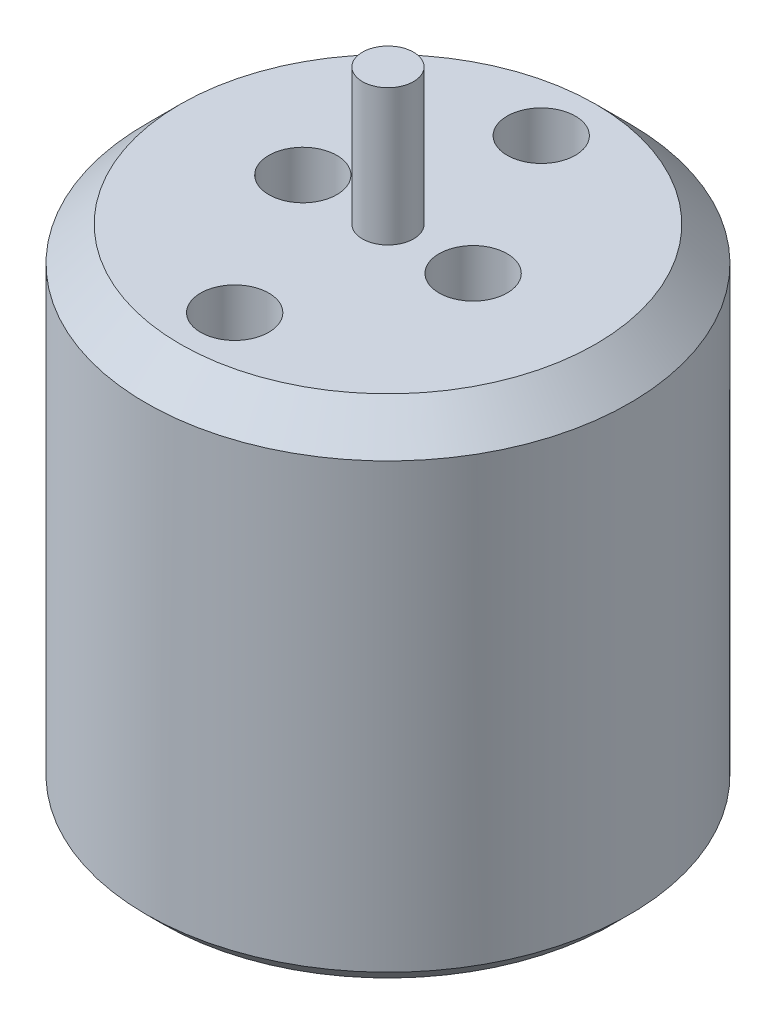
ISO-10303-21;
HEADER;
FILE_DESCRIPTION(('STEP AP214'),'2;1');
FILE_NAME('part.step','',(''),(''),'','','');
FILE_SCHEMA(('AUTOMOTIVE_DESIGN { 1 0 10303 214 1 1 1 1 }'));
ENDSEC;
DATA;
#1=APPLICATION_CONTEXT('core data for automotive mechanical design processes');
#2=APPLICATION_PROTOCOL_DEFINITION('international standard','automotive_design',2000,#1);
#3=PRODUCT_CONTEXT('',#1,'mechanical');
#4=PRODUCT('Part','Part','',(#3));
#5=PRODUCT_RELATED_PRODUCT_CATEGORY('part','',(#4));
#6=PRODUCT_DEFINITION_FORMATION('','',#4);
#7=PRODUCT_DEFINITION_CONTEXT('part definition',#1,'design');
#8=PRODUCT_DEFINITION('design','',#6,#7);
#9=PRODUCT_DEFINITION_SHAPE('','',#8);
#10=(LENGTH_UNIT() NAMED_UNIT(*) SI_UNIT(.MILLI.,.METRE.));
#11=(NAMED_UNIT(*) PLANE_ANGLE_UNIT() SI_UNIT($,.RADIAN.));
#12=(NAMED_UNIT(*) SI_UNIT($,.STERADIAN.) SOLID_ANGLE_UNIT());
#13=UNCERTAINTY_MEASURE_WITH_UNIT(LENGTH_MEASURE(1.E-05),#10,'distance_accuracy_value','');
#14=(GEOMETRIC_REPRESENTATION_CONTEXT(3) GLOBAL_UNCERTAINTY_ASSIGNED_CONTEXT((#13)) GLOBAL_UNIT_ASSIGNED_CONTEXT((#10,
#11,#12)) REPRESENTATION_CONTEXT('',''));
#15=CARTESIAN_POINT('',(0.,0.,0.));
#16=DIRECTION('',(0.,0.,1.));
#17=DIRECTION('',(1.,0.,0.));
#18=AXIS2_PLACEMENT_3D('',#15,#16,#17);
#19=CARTESIAN_POINT('',(0.,14.5,0.));
#20=DIRECTION('',(0.,-1.,0.));
#21=DIRECTION('',(0.,0.,-1.));
#22=AXIS2_PLACEMENT_3D('',#19,#20,#21);
#23=CYLINDRICAL_SURFACE('',#22,7.1);
#24=CARTESIAN_POINT('',(0.,0.500000000000014,0.));
#25=DIRECTION('',(0.,1.,0.));
#26=DIRECTION('',(0.,0.,1.));
#27=AXIS2_PLACEMENT_3D('',#24,#25,#26);
#28=CIRCLE('',#27,7.1);
#29=CARTESIAN_POINT('',(0.,0.500000000000014,-7.1));
#30=VERTEX_POINT('',#29);
#31=EDGE_CURVE('E42',#30,#30,#28,.T.);
#32=CARTESIAN_POINT('',(0.,13.5,0.));
#33=DIRECTION('',(0.,1.,0.));
#34=DIRECTION('',(0.,0.,1.));
#35=AXIS2_PLACEMENT_3D('',#32,#33,#34);
#36=CIRCLE('',#35,7.1);
#37=CARTESIAN_POINT('',(0.,13.5,-7.1));
#38=VERTEX_POINT('',#37);
#39=EDGE_CURVE('E46',#38,#38,#36,.F.);
#40=CARTESIAN_POINT('',(0.,0.500000000000014,-7.1));
#41=CARTESIAN_POINT('',(0.,0.635416666666681,-7.1));
#42=CARTESIAN_POINT('',(0.,0.770833333333348,-7.1));
#43=CARTESIAN_POINT('',(0.,1.04166666666668,-7.1));
#44=CARTESIAN_POINT('',(0.,1.17708333333335,-7.1));
#45=CARTESIAN_POINT('',(0.,1.44791666666668,-7.1));
#46=CARTESIAN_POINT('',(0.,1.58333333333335,-7.1));
#47=CARTESIAN_POINT('',(0.,1.85416666666668,-7.1));
#48=CARTESIAN_POINT('',(0.,1.98958333333335,-7.1));
#49=CARTESIAN_POINT('',(0.,2.26041666666668,-7.1));
#50=CARTESIAN_POINT('',(0.,2.39583333333335,-7.1));
#51=CARTESIAN_POINT('',(0.,2.66666666666668,-7.1));
#52=CARTESIAN_POINT('',(0.,2.80208333333335,-7.1));
#53=CARTESIAN_POINT('',(0.,3.07291666666668,-7.1));
#54=CARTESIAN_POINT('',(0.,3.20833333333335,-7.1));
#55=CARTESIAN_POINT('',(0.,3.47916666666668,-7.1));
#56=CARTESIAN_POINT('',(0.,3.61458333333335,-7.1));
#57=CARTESIAN_POINT('',(0.,3.88541666666668,-7.1));
#58=CARTESIAN_POINT('',(0.,4.02083333333335,-7.1));
#59=CARTESIAN_POINT('',(0.,4.29166666666668,-7.1));
#60=CARTESIAN_POINT('',(0.,4.42708333333335,-7.1));
#61=CARTESIAN_POINT('',(0.,4.69791666666668,-7.1));
#62=CARTESIAN_POINT('',(0.,4.83333333333335,-7.1));
#63=CARTESIAN_POINT('',(0.,5.10416666666668,-7.1));
#64=CARTESIAN_POINT('',(0.,5.23958333333335,-7.1));
#65=CARTESIAN_POINT('',(0.,5.51041666666668,-7.1));
#66=CARTESIAN_POINT('',(0.,5.64583333333335,-7.1));
#67=CARTESIAN_POINT('',(0.,5.91666666666668,-7.1));
#68=CARTESIAN_POINT('',(0.,6.05208333333335,-7.1));
#69=CARTESIAN_POINT('',(0.,6.32291666666668,-7.1));
#70=CARTESIAN_POINT('',(0.,6.45833333333335,-7.1));
#71=CARTESIAN_POINT('',(0.,6.72916666666668,-7.1));
#72=CARTESIAN_POINT('',(0.,6.86458333333335,-7.1));
#73=CARTESIAN_POINT('',(0.,7.13541666666668,-7.1));
#74=CARTESIAN_POINT('',(0.,7.27083333333335,-7.1));
#75=CARTESIAN_POINT('',(0.,7.54166666666668,-7.1));
#76=CARTESIAN_POINT('',(0.,7.67708333333335,-7.1));
#77=CARTESIAN_POINT('',(0.,7.94791666666668,-7.1));
#78=CARTESIAN_POINT('',(0.,8.08333333333335,-7.1));
#79=CARTESIAN_POINT('',(0.,8.35416666666668,-7.1));
#80=CARTESIAN_POINT('',(0.,8.48958333333335,-7.1));
#81=CARTESIAN_POINT('',(0.,8.76041666666668,-7.1));
#82=CARTESIAN_POINT('',(0.,8.89583333333335,-7.1));
#83=CARTESIAN_POINT('',(0.,9.16666666666668,-7.1));
#84=CARTESIAN_POINT('',(0.,9.30208333333335,-7.1));
#85=CARTESIAN_POINT('',(0.,9.57291666666668,-7.1));
#86=CARTESIAN_POINT('',(0.,9.70833333333335,-7.1));
#87=CARTESIAN_POINT('',(0.,9.97916666666668,-7.1));
#88=CARTESIAN_POINT('',(0.,10.1145833333333,-7.1));
#89=CARTESIAN_POINT('',(0.,10.3854166666667,-7.1));
#90=CARTESIAN_POINT('',(0.,10.5208333333333,-7.1));
#91=CARTESIAN_POINT('',(0.,10.7916666666667,-7.1));
#92=CARTESIAN_POINT('',(0.,10.9270833333333,-7.1));
#93=CARTESIAN_POINT('',(0.,11.1979166666667,-7.1));
#94=CARTESIAN_POINT('',(0.,11.3333333333333,-7.1));
#95=CARTESIAN_POINT('',(0.,11.6041666666667,-7.1));
#96=CARTESIAN_POINT('',(0.,11.7395833333333,-7.1));
#97=CARTESIAN_POINT('',(0.,12.0104166666667,-7.1));
#98=CARTESIAN_POINT('',(0.,12.1458333333333,-7.1));
#99=CARTESIAN_POINT('',(0.,12.4166666666667,-7.1));
#100=CARTESIAN_POINT('',(0.,12.5520833333333,-7.1));
#101=CARTESIAN_POINT('',(0.,12.8229166666667,-7.1));
#102=CARTESIAN_POINT('',(0.,12.9583333333333,-7.1));
#103=CARTESIAN_POINT('',(0.,13.2291666666667,-7.1));
#104=CARTESIAN_POINT('',(0.,13.3645833333333,-7.1));
#105=CARTESIAN_POINT('',(0.,13.5,-7.1));
#106=B_SPLINE_CURVE_WITH_KNOTS('',3,(#40,#41,#42,#43,#44,#45,#46,#47,#48,#49,#50,#51,#52,#53,
#54,#55,#56,#57,#58,#59,#60,#61,#62,#63,#64,#65,#66,#67,#68,#69,#70,#71,#72,#73,#74,#75,#76,#77,
#78,#79,#80,#81,#82,#83,#84,#85,#86,#87,#88,#89,#90,#91,#92,#93,#94,#95,#96,#97,#98,#99,#100,
#101,#102,#103,#104,#105),.UNSPECIFIED.,.F.,.F.,(4,2,2,2,2,2,2,2,2,2,2,2,2,2,2,2,2,2,2,2,2,2,2,
2,2,2,2,2,2,2,2,2,4),(0.,0.40625,0.812500000000001,1.21875,1.625,2.03125,2.4375,2.84375,3.25,
3.65625,4.0625,4.46875,4.875,5.28125,5.6875,6.09375,6.5,6.90625,7.3125,7.71875,8.125,8.53125,
8.9375,9.34375,9.75,10.15625,10.5625,10.96875,11.375,11.78125,12.1875,12.59375,13.),.UNSPECIFIED.);
#107=EDGE_CURVE('BSEAM35',#30,#38,#106,.T.);
#108=ORIENTED_EDGE('',*,*,#31,.T.);
#109=ORIENTED_EDGE('',*,*,#39,.T.);
#110=ORIENTED_EDGE('',*,*,#107,.T.);
#111=ORIENTED_EDGE('',*,*,#107,.F.);
#112=EDGE_LOOP('',(#108,#110,#109,#111));
#113=FACE_BOUND('',#112,.T.);
#114=ADVANCED_FACE('F35',(#113),#23,.T.);
#115=CARTESIAN_POINT('',(0.,14.5,0.));
#116=DIRECTION('',(0.,1.,0.));
#117=DIRECTION('',(0.,0.,1.));
#118=AXIS2_PLACEMENT_3D('',#115,#116,#117);
#119=PLANE('',#118);
#120=CARTESIAN_POINT('',(0.,14.5,0.));
#121=DIRECTION('',(0.,1.,0.));
#122=DIRECTION('',(0.,0.,1.));
#123=AXIS2_PLACEMENT_3D('',#120,#121,#122);
#124=CIRCLE('',#123,6.10000000000002);
#125=CARTESIAN_POINT('',(0.,14.5,6.10000000000002));
#126=VERTEX_POINT('',#125);
#127=EDGE_CURVE('E50',#126,#126,#124,.T.);
#128=ORIENTED_EDGE('',*,*,#127,.T.);
#129=EDGE_LOOP('',(#128));
#130=FACE_BOUND('',#129,.T.);
#131=CARTESIAN_POINT('',(0.,14.5,-4.5));
#132=DIRECTION('',(0.,1.,0.));
#133=DIRECTION('',(0.,0.,1.));
#134=AXIS2_PLACEMENT_3D('',#131,#132,#133);
#135=CIRCLE('',#134,1.);
#136=CARTESIAN_POINT('',(0.,14.5,-3.5));
#137=VERTEX_POINT('',#136);
#138=EDGE_CURVE('E104',#137,#137,#135,.T.);
#139=ORIENTED_EDGE('',*,*,#138,.F.);
#140=EDGE_LOOP('',(#139));
#141=FACE_BOUND('',#140,.T.);
#142=CARTESIAN_POINT('',(0.,14.5,4.5));
#143=DIRECTION('',(0.,1.,0.));
#144=DIRECTION('',(0.,0.,1.));
#145=AXIS2_PLACEMENT_3D('',#142,#143,#144);
#146=CIRCLE('',#145,1.);
#147=CARTESIAN_POINT('',(0.,14.5,5.5));
#148=VERTEX_POINT('',#147);
#149=EDGE_CURVE('E98',#148,#148,#146,.T.);
#150=ORIENTED_EDGE('',*,*,#149,.F.);
#151=EDGE_LOOP('',(#150));
#152=FACE_BOUND('',#151,.T.);
#153=CARTESIAN_POINT('',(2.5,14.5,0.));
#154=DIRECTION('',(0.,1.,0.));
#155=DIRECTION('',(0.,0.,1.));
#156=AXIS2_PLACEMENT_3D('',#153,#154,#155);
#157=CIRCLE('',#156,1.);
#158=CARTESIAN_POINT('',(2.5,14.5,1.));
#159=VERTEX_POINT('',#158);
#160=EDGE_CURVE('E92',#159,#159,#157,.T.);
#161=ORIENTED_EDGE('',*,*,#160,.F.);
#162=EDGE_LOOP('',(#161));
#163=FACE_BOUND('',#162,.T.);
#164=CARTESIAN_POINT('',(-2.5,14.5,0.));
#165=DIRECTION('',(0.,1.,0.));
#166=DIRECTION('',(0.,0.,1.));
#167=AXIS2_PLACEMENT_3D('',#164,#165,#166);
#168=CIRCLE('',#167,1.);
#169=CARTESIAN_POINT('',(-2.5,14.5,1.));
#170=VERTEX_POINT('',#169);
#171=EDGE_CURVE('E86',#170,#170,#168,.T.);
#172=ORIENTED_EDGE('',*,*,#171,.F.);
#173=EDGE_LOOP('',(#172));
#174=FACE_BOUND('',#173,.T.);
#175=CARTESIAN_POINT('',(0.,14.5,0.));
#176=DIRECTION('',(0.,1.,0.));
#177=DIRECTION('',(0.,0.,1.));
#178=AXIS2_PLACEMENT_3D('',#175,#176,#177);
#179=CIRCLE('',#178,0.75);
#180=CARTESIAN_POINT('',(0.,14.5,0.75));
#181=VERTEX_POINT('',#180);
#182=EDGE_CURVE('E56',#181,#181,#179,.T.);
#183=ORIENTED_EDGE('',*,*,#182,.F.);
#184=EDGE_LOOP('',(#183));
#185=FACE_BOUND('',#184,.T.);
#186=ADVANCED_FACE('F119',(#130,#141,#152,#163,#174,#185),#119,.T.);
#187=CARTESIAN_POINT('',(0.,0.,0.));
#188=DIRECTION('',(0.,1.,0.));
#189=DIRECTION('',(0.,0.,1.));
#190=AXIS2_PLACEMENT_3D('',#187,#188,#189);
#191=PLANE('',#190);
#192=CARTESIAN_POINT('',(0.,0.,0.));
#193=DIRECTION('',(0.,1.,0.));
#194=DIRECTION('',(0.,0.,1.));
#195=AXIS2_PLACEMENT_3D('',#192,#193,#194);
#196=CIRCLE('',#195,6.59999999999998);
#197=CARTESIAN_POINT('',(0.,0.,6.59999999999998));
#198=VERTEX_POINT('',#197);
#199=EDGE_CURVE('E10',#198,#198,#196,.F.);
#200=ORIENTED_EDGE('',*,*,#199,.T.);
#201=EDGE_LOOP('',(#200));
#202=FACE_BOUND('',#201,.T.);
#203=CARTESIAN_POINT('',(0.,0.,4.5));
#204=DIRECTION('',(0.,-1.,0.));
#205=DIRECTION('',(0.,0.,-1.));
#206=AXIS2_PLACEMENT_3D('',#203,#204,#205);
#207=CIRCLE('',#206,1.);
#208=CARTESIAN_POINT('',(0.,0.,3.5));
#209=VERTEX_POINT('',#208);
#210=EDGE_CURVE('E81',#209,#209,#207,.T.);
#211=ORIENTED_EDGE('',*,*,#210,.F.);
#212=EDGE_LOOP('',(#211));
#213=FACE_BOUND('',#212,.T.);
#214=CARTESIAN_POINT('',(0.,0.,-4.5));
#215=DIRECTION('',(0.,-1.,0.));
#216=DIRECTION('',(0.,0.,-1.));
#217=AXIS2_PLACEMENT_3D('',#214,#215,#216);
#218=CIRCLE('',#217,1.);
#219=CARTESIAN_POINT('',(0.,0.,-5.5));
#220=VERTEX_POINT('',#219);
#221=EDGE_CURVE('E75',#220,#220,#218,.T.);
#222=ORIENTED_EDGE('',*,*,#221,.F.);
#223=EDGE_LOOP('',(#222));
#224=FACE_BOUND('',#223,.T.);
#225=CARTESIAN_POINT('',(4.5,0.,0.));
#226=DIRECTION('',(0.,-1.,0.));
#227=DIRECTION('',(0.,0.,-1.));
#228=AXIS2_PLACEMENT_3D('',#225,#226,#227);
#229=CIRCLE('',#228,1.);
#230=CARTESIAN_POINT('',(4.5,0.,-0.999999999999998));
#231=VERTEX_POINT('',#230);
#232=EDGE_CURVE('E68',#231,#231,#229,.T.);
#233=ORIENTED_EDGE('',*,*,#232,.F.);
#234=EDGE_LOOP('',(#233));
#235=FACE_BOUND('',#234,.T.);
#236=CARTESIAN_POINT('',(-4.5,0.,0.));
#237=DIRECTION('',(0.,-1.,0.));
#238=DIRECTION('',(0.,0.,-1.));
#239=AXIS2_PLACEMENT_3D('',#236,#237,#238);
#240=CIRCLE('',#239,1.);
#241=CARTESIAN_POINT('',(-4.5,0.,-1.));
#242=VERTEX_POINT('',#241);
#243=EDGE_CURVE('E62',#242,#242,#240,.T.);
#244=ORIENTED_EDGE('',*,*,#243,.F.);
#245=EDGE_LOOP('',(#244));
#246=FACE_BOUND('',#245,.T.);
#247=ADVANCED_FACE('F122',(#202,#213,#224,#235,#246),#191,.F.);
#248=CARTESIAN_POINT('',(0.,18.5,0.));
#249=DIRECTION('',(0.,-1.,0.));
#250=DIRECTION('',(0.,0.,-1.));
#251=AXIS2_PLACEMENT_3D('',#248,#249,#250);
#252=CYLINDRICAL_SURFACE('',#251,0.75);
#253=CARTESIAN_POINT('',(0.,18.5,0.));
#254=DIRECTION('',(0.,1.,0.));
#255=DIRECTION('',(0.,0.,1.));
#256=AXIS2_PLACEMENT_3D('',#253,#254,#255);
#257=CIRCLE('',#256,0.75);
#258=CARTESIAN_POINT('',(0.,18.5,0.75));
#259=VERTEX_POINT('',#258);
#260=EDGE_CURVE('E55',#259,#259,#257,.T.);
#261=ORIENTED_EDGE('',*,*,#260,.F.);
#262=EDGE_LOOP('',(#261));
#263=FACE_BOUND('',#262,.T.);
#264=ORIENTED_EDGE('',*,*,#182,.T.);
#265=EDGE_LOOP('',(#264));
#266=FACE_BOUND('',#265,.T.);
#267=ADVANCED_FACE('F133',(#263,#266),#252,.T.);
#268=CARTESIAN_POINT('',(0.,18.5,0.));
#269=DIRECTION('',(0.,1.,0.));
#270=DIRECTION('',(0.,0.,1.));
#271=AXIS2_PLACEMENT_3D('',#268,#269,#270);
#272=PLANE('',#271);
#273=ORIENTED_EDGE('',*,*,#260,.T.);
#274=EDGE_LOOP('',(#273));
#275=FACE_BOUND('',#274,.T.);
#276=ADVANCED_FACE('F135',(#275),#272,.T.);
#277=CARTESIAN_POINT('',(-4.5,4.,0.));
#278=DIRECTION('',(0.,-1.,0.));
#279=DIRECTION('',(0.,0.,-1.));
#280=AXIS2_PLACEMENT_3D('',#277,#278,#279);
#281=CYLINDRICAL_SURFACE('',#280,1.);
#282=CARTESIAN_POINT('',(-4.5,4.,0.));
#283=DIRECTION('',(0.,-1.,0.));
#284=DIRECTION('',(0.,0.,-1.));
#285=AXIS2_PLACEMENT_3D('',#282,#283,#284);
#286=CIRCLE('',#285,1.);
#287=CARTESIAN_POINT('',(-4.5,4.,-1.));
#288=VERTEX_POINT('',#287);
#289=EDGE_CURVE('E59',#288,#288,#286,.T.);
#290=ORIENTED_EDGE('',*,*,#289,.F.);
#291=EDGE_LOOP('',(#290));
#292=FACE_BOUND('',#291,.T.);
#293=ORIENTED_EDGE('',*,*,#243,.T.);
#294=EDGE_LOOP('',(#293));
#295=FACE_BOUND('',#294,.T.);
#296=ADVANCED_FACE('F142',(#292,#295),#281,.F.);
#297=CARTESIAN_POINT('',(-4.5,4.,0.));
#298=DIRECTION('',(0.,-1.,0.));
#299=DIRECTION('',(0.,0.,-1.));
#300=AXIS2_PLACEMENT_3D('',#297,#298,#299);
#301=PLANE('',#300);
#302=ORIENTED_EDGE('',*,*,#289,.T.);
#303=EDGE_LOOP('',(#302));
#304=FACE_BOUND('',#303,.T.);
#305=ADVANCED_FACE('F213',(#304),#301,.T.);
#306=CARTESIAN_POINT('',(4.5,4.,0.));
#307=DIRECTION('',(0.,-1.,0.));
#308=DIRECTION('',(0.,0.,-1.));
#309=AXIS2_PLACEMENT_3D('',#306,#307,#308);
#310=CYLINDRICAL_SURFACE('',#309,1.);
#311=CARTESIAN_POINT('',(4.5,4.,0.));
#312=DIRECTION('',(0.,-1.,0.));
#313=DIRECTION('',(0.,0.,-1.));
#314=AXIS2_PLACEMENT_3D('',#311,#312,#313);
#315=CIRCLE('',#314,1.);
#316=CARTESIAN_POINT('',(4.5,4.,-0.999999999999998));
#317=VERTEX_POINT('',#316);
#318=EDGE_CURVE('E71',#317,#317,#315,.T.);
#319=ORIENTED_EDGE('',*,*,#318,.F.);
#320=EDGE_LOOP('',(#319));
#321=FACE_BOUND('',#320,.T.);
#322=ORIENTED_EDGE('',*,*,#232,.T.);
#323=EDGE_LOOP('',(#322));
#324=FACE_BOUND('',#323,.T.);
#325=ADVANCED_FACE('F209',(#321,#324),#310,.F.);
#326=CARTESIAN_POINT('',(4.5,4.,0.));
#327=DIRECTION('',(0.,-1.,0.));
#328=DIRECTION('',(0.,0.,-1.));
#329=AXIS2_PLACEMENT_3D('',#326,#327,#328);
#330=PLANE('',#329);
#331=ORIENTED_EDGE('',*,*,#318,.T.);
#332=EDGE_LOOP('',(#331));
#333=FACE_BOUND('',#332,.T.);
#334=ADVANCED_FACE('F205',(#333),#330,.T.);
#335=CARTESIAN_POINT('',(0.,4.,-4.5));
#336=DIRECTION('',(0.,-1.,0.));
#337=DIRECTION('',(0.,0.,-1.));
#338=AXIS2_PLACEMENT_3D('',#335,#336,#337);
#339=CYLINDRICAL_SURFACE('',#338,1.);
#340=CARTESIAN_POINT('',(0.,4.,-4.5));
#341=DIRECTION('',(0.,-1.,0.));
#342=DIRECTION('',(0.,0.,-1.));
#343=AXIS2_PLACEMENT_3D('',#340,#341,#342);
#344=CIRCLE('',#343,1.);
#345=CARTESIAN_POINT('',(0.,4.,-5.5));
#346=VERTEX_POINT('',#345);
#347=EDGE_CURVE('E78',#346,#346,#344,.T.);
#348=ORIENTED_EDGE('',*,*,#347,.F.);
#349=EDGE_LOOP('',(#348));
#350=FACE_BOUND('',#349,.T.);
#351=ORIENTED_EDGE('',*,*,#221,.T.);
#352=EDGE_LOOP('',(#351));
#353=FACE_BOUND('',#352,.T.);
#354=ADVANCED_FACE('F201',(#350,#353),#339,.F.);
#355=CARTESIAN_POINT('',(0.,4.,-4.5));
#356=DIRECTION('',(0.,-1.,0.));
#357=DIRECTION('',(0.,0.,-1.));
#358=AXIS2_PLACEMENT_3D('',#355,#356,#357);
#359=PLANE('',#358);
#360=ORIENTED_EDGE('',*,*,#347,.T.);
#361=EDGE_LOOP('',(#360));
#362=FACE_BOUND('',#361,.T.);
#363=ADVANCED_FACE('F197',(#362),#359,.T.);
#364=CARTESIAN_POINT('',(0.,4.,4.5));
#365=DIRECTION('',(0.,-1.,0.));
#366=DIRECTION('',(0.,0.,-1.));
#367=AXIS2_PLACEMENT_3D('',#364,#365,#366);
#368=CYLINDRICAL_SURFACE('',#367,1.);
#369=CARTESIAN_POINT('',(0.,4.,4.5));
#370=DIRECTION('',(0.,-1.,0.));
#371=DIRECTION('',(0.,0.,-1.));
#372=AXIS2_PLACEMENT_3D('',#369,#370,#371);
#373=CIRCLE('',#372,1.);
#374=CARTESIAN_POINT('',(0.,4.,3.5));
#375=VERTEX_POINT('',#374);
#376=EDGE_CURVE('E65',#375,#375,#373,.T.);
#377=ORIENTED_EDGE('',*,*,#376,.F.);
#378=EDGE_LOOP('',(#377));
#379=FACE_BOUND('',#378,.T.);
#380=ORIENTED_EDGE('',*,*,#210,.T.);
#381=EDGE_LOOP('',(#380));
#382=FACE_BOUND('',#381,.T.);
#383=ADVANCED_FACE('F193',(#379,#382),#368,.F.);
#384=CARTESIAN_POINT('',(0.,4.,4.5));
#385=DIRECTION('',(0.,-1.,0.));
#386=DIRECTION('',(0.,0.,-1.));
#387=AXIS2_PLACEMENT_3D('',#384,#385,#386);
#388=PLANE('',#387);
#389=ORIENTED_EDGE('',*,*,#376,.T.);
#390=EDGE_LOOP('',(#389));
#391=FACE_BOUND('',#390,.T.);
#392=ADVANCED_FACE('F189',(#391),#388,.T.);
#393=CARTESIAN_POINT('',(-2.5,10.5,0.));
#394=DIRECTION('',(0.,1.,0.));
#395=DIRECTION('',(0.,0.,1.));
#396=AXIS2_PLACEMENT_3D('',#393,#394,#395);
#397=CYLINDRICAL_SURFACE('',#396,1.);
#398=CARTESIAN_POINT('',(-2.5,10.5,0.));
#399=DIRECTION('',(0.,1.,0.));
#400=DIRECTION('',(0.,0.,1.));
#401=AXIS2_PLACEMENT_3D('',#398,#399,#400);
#402=CIRCLE('',#401,1.);
#403=CARTESIAN_POINT('',(-2.5,10.5,1.));
#404=VERTEX_POINT('',#403);
#405=EDGE_CURVE('E72',#404,#404,#402,.T.);
#406=ORIENTED_EDGE('',*,*,#405,.F.);
#407=EDGE_LOOP('',(#406));
#408=FACE_BOUND('',#407,.T.);
#409=ORIENTED_EDGE('',*,*,#171,.T.);
#410=EDGE_LOOP('',(#409));
#411=FACE_BOUND('',#410,.T.);
#412=ADVANCED_FACE('F185',(#408,#411),#397,.F.);
#413=CARTESIAN_POINT('',(-2.5,10.5,0.));
#414=DIRECTION('',(0.,1.,0.));
#415=DIRECTION('',(0.,0.,1.));
#416=AXIS2_PLACEMENT_3D('',#413,#414,#415);
#417=PLANE('',#416);
#418=ORIENTED_EDGE('',*,*,#405,.T.);
#419=EDGE_LOOP('',(#418));
#420=FACE_BOUND('',#419,.T.);
#421=ADVANCED_FACE('F181',(#420),#417,.T.);
#422=CARTESIAN_POINT('',(2.5,10.5,0.));
#423=DIRECTION('',(0.,1.,0.));
#424=DIRECTION('',(0.,0.,1.));
#425=AXIS2_PLACEMENT_3D('',#422,#423,#424);
#426=CYLINDRICAL_SURFACE('',#425,1.);
#427=CARTESIAN_POINT('',(2.5,10.5,0.));
#428=DIRECTION('',(0.,1.,0.));
#429=DIRECTION('',(0.,0.,1.));
#430=AXIS2_PLACEMENT_3D('',#427,#428,#429);
#431=CIRCLE('',#430,1.);
#432=CARTESIAN_POINT('',(2.5,10.5,1.));
#433=VERTEX_POINT('',#432);
#434=EDGE_CURVE('E95',#433,#433,#431,.T.);
#435=ORIENTED_EDGE('',*,*,#434,.F.);
#436=EDGE_LOOP('',(#435));
#437=FACE_BOUND('',#436,.T.);
#438=ORIENTED_EDGE('',*,*,#160,.T.);
#439=EDGE_LOOP('',(#438));
#440=FACE_BOUND('',#439,.T.);
#441=ADVANCED_FACE('F177',(#437,#440),#426,.F.);
#442=CARTESIAN_POINT('',(2.5,10.5,0.));
#443=DIRECTION('',(0.,1.,0.));
#444=DIRECTION('',(0.,0.,1.));
#445=AXIS2_PLACEMENT_3D('',#442,#443,#444);
#446=PLANE('',#445);
#447=ORIENTED_EDGE('',*,*,#434,.T.);
#448=EDGE_LOOP('',(#447));
#449=FACE_BOUND('',#448,.T.);
#450=ADVANCED_FACE('F173',(#449),#446,.T.);
#451=CARTESIAN_POINT('',(0.,10.5,4.5));
#452=DIRECTION('',(0.,1.,0.));
#453=DIRECTION('',(0.,0.,1.));
#454=AXIS2_PLACEMENT_3D('',#451,#452,#453);
#455=CYLINDRICAL_SURFACE('',#454,1.);
#456=CARTESIAN_POINT('',(0.,10.5,4.5));
#457=DIRECTION('',(0.,1.,0.));
#458=DIRECTION('',(0.,0.,1.));
#459=AXIS2_PLACEMENT_3D('',#456,#457,#458);
#460=CIRCLE('',#459,1.);
#461=CARTESIAN_POINT('',(0.,10.5,5.5));
#462=VERTEX_POINT('',#461);
#463=EDGE_CURVE('E101',#462,#462,#460,.T.);
#464=ORIENTED_EDGE('',*,*,#463,.F.);
#465=EDGE_LOOP('',(#464));
#466=FACE_BOUND('',#465,.T.);
#467=ORIENTED_EDGE('',*,*,#149,.T.);
#468=EDGE_LOOP('',(#467));
#469=FACE_BOUND('',#468,.T.);
#470=ADVANCED_FACE('F169',(#466,#469),#455,.F.);
#471=CARTESIAN_POINT('',(0.,10.5,4.5));
#472=DIRECTION('',(0.,1.,0.));
#473=DIRECTION('',(0.,0.,1.));
#474=AXIS2_PLACEMENT_3D('',#471,#472,#473);
#475=PLANE('',#474);
#476=ORIENTED_EDGE('',*,*,#463,.T.);
#477=EDGE_LOOP('',(#476));
#478=FACE_BOUND('',#477,.T.);
#479=ADVANCED_FACE('F115',(#478),#475,.T.);
#480=CARTESIAN_POINT('',(0.,10.5,-4.5));
#481=DIRECTION('',(0.,1.,0.));
#482=DIRECTION('',(0.,0.,1.));
#483=AXIS2_PLACEMENT_3D('',#480,#481,#482);
#484=CYLINDRICAL_SURFACE('',#483,1.);
#485=CARTESIAN_POINT('',(0.,10.5,-4.5));
#486=DIRECTION('',(0.,1.,0.));
#487=DIRECTION('',(0.,0.,1.));
#488=AXIS2_PLACEMENT_3D('',#485,#486,#487);
#489=CIRCLE('',#488,1.);
#490=CARTESIAN_POINT('',(0.,10.5,-3.5));
#491=VERTEX_POINT('',#490);
#492=EDGE_CURVE('E89',#491,#491,#489,.T.);
#493=ORIENTED_EDGE('',*,*,#492,.F.);
#494=EDGE_LOOP('',(#493));
#495=FACE_BOUND('',#494,.T.);
#496=ORIENTED_EDGE('',*,*,#138,.T.);
#497=EDGE_LOOP('',(#496));
#498=FACE_BOUND('',#497,.T.);
#499=ADVANCED_FACE('F112',(#495,#498),#484,.F.);
#500=CARTESIAN_POINT('',(0.,10.5,-4.5));
#501=DIRECTION('',(0.,1.,0.));
#502=DIRECTION('',(0.,0.,1.));
#503=AXIS2_PLACEMENT_3D('',#500,#501,#502);
#504=PLANE('',#503);
#505=ORIENTED_EDGE('',*,*,#492,.T.);
#506=EDGE_LOOP('',(#505));
#507=FACE_BOUND('',#506,.T.);
#508=ADVANCED_FACE('F110',(#507),#504,.T.);
#509=CARTESIAN_POINT('',(0.,14.5,0.));
#510=DIRECTION('',(0.,-1.,0.));
#511=DIRECTION('',(0.,0.,-1.));
#512=AXIS2_PLACEMENT_3D('',#509,#510,#511);
#513=CONICAL_SURFACE('',#512,6.10000000000002,0.785398163397447);
#514=ORIENTED_EDGE('',*,*,#39,.F.);
#515=EDGE_LOOP('',(#514));
#516=FACE_BOUND('',#515,.T.);
#517=ORIENTED_EDGE('',*,*,#127,.F.);
#518=EDGE_LOOP('',(#517));
#519=FACE_BOUND('',#518,.T.);
#520=ADVANCED_FACE('F152',(#516,#519),#513,.T.);
#521=CARTESIAN_POINT('',(0.,0.500000000000014,0.));
#522=DIRECTION('',(0.,1.,0.));
#523=DIRECTION('',(0.,0.,1.));
#524=AXIS2_PLACEMENT_3D('',#521,#522,#523);
#525=CONICAL_SURFACE('',#524,7.1,0.78539816339745);
#526=ORIENTED_EDGE('',*,*,#199,.F.);
#527=EDGE_LOOP('',(#526));
#528=FACE_BOUND('',#527,.T.);
#529=ORIENTED_EDGE('',*,*,#31,.F.);
#530=EDGE_LOOP('',(#529));
#531=FACE_BOUND('',#530,.T.);
#532=ADVANCED_FACE('F37',(#528,#531),#525,.T.);
#533=CLOSED_SHELL('',(#114,#186,#247,#267,#276,#296,#305,#325,#334,#354,#363,#383,#392,#412,
#421,#441,#450,#470,#479,#499,#508,#520,#532));
#534=MANIFOLD_SOLID_BREP('B2',#533);
#535=ADVANCED_BREP_SHAPE_REPRESENTATION('',(#18,#534),#14);
#536=SHAPE_DEFINITION_REPRESENTATION(#9,#535);
ENDSEC;
END-ISO-10303-21;
